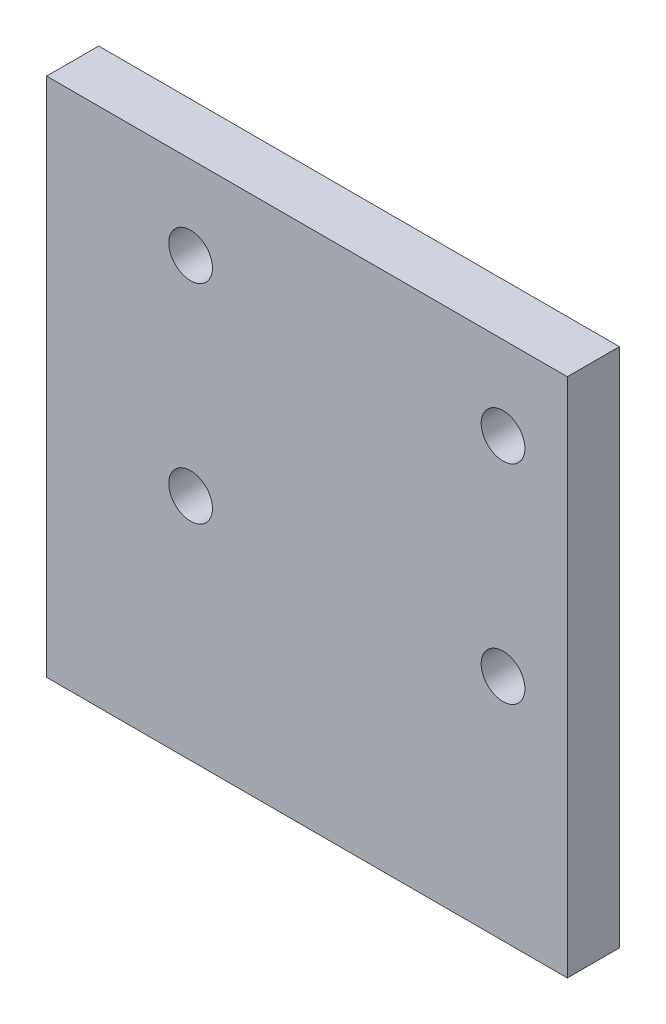
ISO-10303-21;
HEADER;
FILE_DESCRIPTION(('STEP AP214'),'2;1');
FILE_NAME('part.step','',(''),(''),'','','');
FILE_SCHEMA(('AUTOMOTIVE_DESIGN { 1 0 10303 214 1 1 1 1 }'));
ENDSEC;
DATA;
#1=APPLICATION_CONTEXT('core data for automotive mechanical design processes');
#2=APPLICATION_PROTOCOL_DEFINITION('international standard','automotive_design',2000,#1);
#3=PRODUCT_CONTEXT('',#1,'mechanical');
#4=PRODUCT('Part','Part','',(#3));
#5=PRODUCT_RELATED_PRODUCT_CATEGORY('part','',(#4));
#6=PRODUCT_DEFINITION_FORMATION('','',#4);
#7=PRODUCT_DEFINITION_CONTEXT('part definition',#1,'design');
#8=PRODUCT_DEFINITION('design','',#6,#7);
#9=PRODUCT_DEFINITION_SHAPE('','',#8);
#10=(LENGTH_UNIT() NAMED_UNIT(*) SI_UNIT(.MILLI.,.METRE.));
#11=(NAMED_UNIT(*) PLANE_ANGLE_UNIT() SI_UNIT($,.RADIAN.));
#12=(NAMED_UNIT(*) SI_UNIT($,.STERADIAN.) SOLID_ANGLE_UNIT());
#13=UNCERTAINTY_MEASURE_WITH_UNIT(LENGTH_MEASURE(1.E-05),#10,'distance_accuracy_value','');
#14=(GEOMETRIC_REPRESENTATION_CONTEXT(3) GLOBAL_UNCERTAINTY_ASSIGNED_CONTEXT((#13)) GLOBAL_UNIT_ASSIGNED_CONTEXT((#10,
#11,#12)) REPRESENTATION_CONTEXT('',''));
#15=CARTESIAN_POINT('',(0.,0.,0.));
#16=DIRECTION('',(0.,0.,1.));
#17=DIRECTION('',(1.,0.,0.));
#18=AXIS2_PLACEMENT_3D('',#15,#16,#17);
#19=CARTESIAN_POINT('',(25.,25.,5.));
#20=DIRECTION('',(-1.,0.,0.));
#21=DIRECTION('',(0.,-1.,0.));
#22=AXIS2_PLACEMENT_3D('',#19,#20,#21);
#23=PLANE('',#22);
#24=DIRECTION('',(0.,1.,0.));
#25=VECTOR('',#24,1.);
#26=CARTESIAN_POINT('',(25.,25.,0.));
#27=LINE('',#26,#25);
#28=CARTESIAN_POINT('',(25.,-25.,0.));
#29=VERTEX_POINT('',#28);
#30=CARTESIAN_POINT('',(25.,25.,0.));
#31=VERTEX_POINT('',#30);
#32=EDGE_CURVE('E110',#29,#31,#27,.T.);
#33=ORIENTED_EDGE('',*,*,#32,.T.);
#34=DIRECTION('',(0.,0.,-1.));
#35=VECTOR('',#34,1.);
#36=CARTESIAN_POINT('',(25.,25.,5.));
#37=LINE('',#36,#35);
#38=CARTESIAN_POINT('',(25.,25.,5.));
#39=VERTEX_POINT('',#38);
#40=EDGE_CURVE('E11',#39,#31,#37,.T.);
#41=ORIENTED_EDGE('',*,*,#40,.F.);
#42=DIRECTION('',(0.,1.,0.));
#43=VECTOR('',#42,1.);
#44=CARTESIAN_POINT('',(25.,25.,5.));
#45=LINE('',#44,#43);
#46=CARTESIAN_POINT('',(25.,-25.,5.));
#47=VERTEX_POINT('',#46);
#48=EDGE_CURVE('E94',#47,#39,#45,.T.);
#49=ORIENTED_EDGE('',*,*,#48,.F.);
#50=DIRECTION('',(0.,0.,-1.));
#51=VECTOR('',#50,1.);
#52=CARTESIAN_POINT('',(25.,-25.,5.));
#53=LINE('',#52,#51);
#54=EDGE_CURVE('E106',#47,#29,#53,.T.);
#55=ORIENTED_EDGE('',*,*,#54,.T.);
#56=EDGE_LOOP('',(#33,#41,#49,#55));
#57=FACE_BOUND('',#56,.T.);
#58=ADVANCED_FACE('F42',(#57),#23,.F.);
#59=CARTESIAN_POINT('',(-25.,25.,5.));
#60=DIRECTION('',(0.,-1.,0.));
#61=DIRECTION('',(0.,0.,-1.));
#62=AXIS2_PLACEMENT_3D('',#59,#60,#61);
#63=PLANE('',#62);
#64=DIRECTION('',(-1.,0.,0.));
#65=VECTOR('',#64,1.);
#66=CARTESIAN_POINT('',(-25.,25.,0.));
#67=LINE('',#66,#65);
#68=CARTESIAN_POINT('',(-25.,25.,0.));
#69=VERTEX_POINT('',#68);
#70=EDGE_CURVE('E99',#31,#69,#67,.T.);
#71=ORIENTED_EDGE('',*,*,#70,.T.);
#72=DIRECTION('',(0.,0.,-1.));
#73=VECTOR('',#72,1.);
#74=CARTESIAN_POINT('',(-25.,25.,5.));
#75=LINE('',#74,#73);
#76=CARTESIAN_POINT('',(-25.,25.,5.));
#77=VERTEX_POINT('',#76);
#78=EDGE_CURVE('E51',#77,#69,#75,.T.);
#79=ORIENTED_EDGE('',*,*,#78,.F.);
#80=DIRECTION('',(-1.,0.,0.));
#81=VECTOR('',#80,1.);
#82=CARTESIAN_POINT('',(-25.,25.,5.));
#83=LINE('',#82,#81);
#84=EDGE_CURVE('E89',#39,#77,#83,.T.);
#85=ORIENTED_EDGE('',*,*,#84,.F.);
#86=ORIENTED_EDGE('',*,*,#40,.T.);
#87=EDGE_LOOP('',(#71,#79,#85,#86));
#88=FACE_BOUND('',#87,.T.);
#89=ADVANCED_FACE('F98',(#88),#63,.F.);
#90=CARTESIAN_POINT('',(-25.,25.,5.));
#91=DIRECTION('',(1.,0.,0.));
#92=DIRECTION('',(0.,1.,0.));
#93=AXIS2_PLACEMENT_3D('',#90,#91,#92);
#94=PLANE('',#93);
#95=DIRECTION('',(0.,-1.,0.));
#96=VECTOR('',#95,1.);
#97=CARTESIAN_POINT('',(-25.,25.,0.));
#98=LINE('',#97,#96);
#99=CARTESIAN_POINT('',(-25.,-25.,0.));
#100=VERTEX_POINT('',#99);
#101=EDGE_CURVE('E76',#69,#100,#98,.T.);
#102=ORIENTED_EDGE('',*,*,#101,.T.);
#103=DIRECTION('',(0.,0.,-1.));
#104=VECTOR('',#103,1.);
#105=CARTESIAN_POINT('',(-25.,-25.,5.));
#106=LINE('',#105,#104);
#107=CARTESIAN_POINT('',(-25.,-25.,5.));
#108=VERTEX_POINT('',#107);
#109=EDGE_CURVE('E101',#108,#100,#106,.T.);
#110=ORIENTED_EDGE('',*,*,#109,.F.);
#111=DIRECTION('',(0.,-1.,0.));
#112=VECTOR('',#111,1.);
#113=CARTESIAN_POINT('',(-25.,25.,5.));
#114=LINE('',#113,#112);
#115=EDGE_CURVE('E92',#77,#108,#114,.T.);
#116=ORIENTED_EDGE('',*,*,#115,.F.);
#117=ORIENTED_EDGE('',*,*,#78,.T.);
#118=EDGE_LOOP('',(#102,#110,#116,#117));
#119=FACE_BOUND('',#118,.T.);
#120=ADVANCED_FACE('F102',(#119),#94,.F.);
#121=CARTESIAN_POINT('',(-25.,-25.,5.));
#122=DIRECTION('',(0.,1.,0.));
#123=DIRECTION('',(0.,0.,1.));
#124=AXIS2_PLACEMENT_3D('',#121,#122,#123);
#125=PLANE('',#124);
#126=DIRECTION('',(1.,0.,0.));
#127=VECTOR('',#126,1.);
#128=CARTESIAN_POINT('',(-25.,-25.,0.));
#129=LINE('',#128,#127);
#130=EDGE_CURVE('E82',#100,#29,#129,.T.);
#131=ORIENTED_EDGE('',*,*,#130,.T.);
#132=ORIENTED_EDGE('',*,*,#54,.F.);
#133=DIRECTION('',(1.,0.,0.));
#134=VECTOR('',#133,1.);
#135=CARTESIAN_POINT('',(-25.,-25.,5.));
#136=LINE('',#135,#134);
#137=EDGE_CURVE('E59',#108,#47,#136,.T.);
#138=ORIENTED_EDGE('',*,*,#137,.F.);
#139=ORIENTED_EDGE('',*,*,#109,.T.);
#140=EDGE_LOOP('',(#131,#132,#138,#139));
#141=FACE_BOUND('',#140,.T.);
#142=ADVANCED_FACE('F124',(#141),#125,.F.);
#143=CARTESIAN_POINT('',(0.,0.,5.));
#144=DIRECTION('',(0.,0.,1.));
#145=DIRECTION('',(1.,0.,0.));
#146=AXIS2_PLACEMENT_3D('',#143,#144,#145);
#147=PLANE('',#146);
#148=CARTESIAN_POINT('',(18.8264685112438,-3.00000000000002,5.));
#149=DIRECTION('',(0.,0.,1.));
#150=DIRECTION('',(1.,0.,0.));
#151=AXIS2_PLACEMENT_3D('',#148,#149,#150);
#152=CIRCLE('',#151,2.1);
#153=CARTESIAN_POINT('',(20.9264685112438,-3.00000000000002,5.));
#154=VERTEX_POINT('',#153);
#155=EDGE_CURVE('E135',#154,#154,#152,.T.);
#156=ORIENTED_EDGE('',*,*,#155,.F.);
#157=EDGE_LOOP('',(#156));
#158=FACE_BOUND('',#157,.T.);
#159=CARTESIAN_POINT('',(-11.1735314887562,17.,5.));
#160=DIRECTION('',(0.,0.,1.));
#161=DIRECTION('',(1.,0.,0.));
#162=AXIS2_PLACEMENT_3D('',#159,#160,#161);
#163=CIRCLE('',#162,2.1);
#164=CARTESIAN_POINT('',(-9.07353148875616,17.,5.));
#165=VERTEX_POINT('',#164);
#166=EDGE_CURVE('E143',#165,#165,#163,.T.);
#167=ORIENTED_EDGE('',*,*,#166,.F.);
#168=EDGE_LOOP('',(#167));
#169=FACE_BOUND('',#168,.T.);
#170=CARTESIAN_POINT('',(18.8264685112438,17.,5.));
#171=DIRECTION('',(0.,0.,1.));
#172=DIRECTION('',(1.,0.,0.));
#173=AXIS2_PLACEMENT_3D('',#170,#171,#172);
#174=CIRCLE('',#173,2.1);
#175=CARTESIAN_POINT('',(20.9264685112438,17.,5.));
#176=VERTEX_POINT('',#175);
#177=EDGE_CURVE('E144',#176,#176,#174,.T.);
#178=ORIENTED_EDGE('',*,*,#177,.F.);
#179=EDGE_LOOP('',(#178));
#180=FACE_BOUND('',#179,.T.);
#181=CARTESIAN_POINT('',(-11.1735314887562,-3.00000000000002,5.));
#182=DIRECTION('',(0.,0.,1.));
#183=DIRECTION('',(1.,0.,0.));
#184=AXIS2_PLACEMENT_3D('',#181,#182,#183);
#185=CIRCLE('',#184,2.1);
#186=CARTESIAN_POINT('',(-9.07353148875616,-3.00000000000002,5.));
#187=VERTEX_POINT('',#186);
#188=EDGE_CURVE('E131',#187,#187,#185,.T.);
#189=ORIENTED_EDGE('',*,*,#188,.F.);
#190=EDGE_LOOP('',(#189));
#191=FACE_BOUND('',#190,.T.);
#192=ORIENTED_EDGE('',*,*,#48,.T.);
#193=ORIENTED_EDGE('',*,*,#84,.T.);
#194=ORIENTED_EDGE('',*,*,#115,.T.);
#195=ORIENTED_EDGE('',*,*,#137,.T.);
#196=EDGE_LOOP('',(#192,#193,#194,#195));
#197=FACE_BOUND('',#196,.T.);
#198=ADVANCED_FACE('F90',(#158,#169,#180,#191,#197),#147,.T.);
#199=CARTESIAN_POINT('',(0.,0.,0.));
#200=DIRECTION('',(0.,0.,1.));
#201=DIRECTION('',(1.,0.,0.));
#202=AXIS2_PLACEMENT_3D('',#199,#200,#201);
#203=PLANE('',#202);
#204=CARTESIAN_POINT('',(18.8264685112438,-3.00000000000002,0.));
#205=DIRECTION('',(0.,0.,1.));
#206=DIRECTION('',(1.,0.,0.));
#207=AXIS2_PLACEMENT_3D('',#204,#205,#206);
#208=CIRCLE('',#207,2.1);
#209=CARTESIAN_POINT('',(20.9264685112438,-3.00000000000002,0.));
#210=VERTEX_POINT('',#209);
#211=EDGE_CURVE('E148',#210,#210,#208,.T.);
#212=ORIENTED_EDGE('',*,*,#211,.T.);
#213=EDGE_LOOP('',(#212));
#214=FACE_BOUND('',#213,.T.);
#215=CARTESIAN_POINT('',(-11.1735314887562,17.,0.));
#216=DIRECTION('',(0.,0.,1.));
#217=DIRECTION('',(1.,0.,0.));
#218=AXIS2_PLACEMENT_3D('',#215,#216,#217);
#219=CIRCLE('',#218,2.1);
#220=CARTESIAN_POINT('',(-9.07353148875616,17.,0.));
#221=VERTEX_POINT('',#220);
#222=EDGE_CURVE('E139',#221,#221,#219,.T.);
#223=ORIENTED_EDGE('',*,*,#222,.T.);
#224=EDGE_LOOP('',(#223));
#225=FACE_BOUND('',#224,.T.);
#226=CARTESIAN_POINT('',(18.8264685112438,17.,0.));
#227=DIRECTION('',(0.,0.,1.));
#228=DIRECTION('',(1.,0.,0.));
#229=AXIS2_PLACEMENT_3D('',#226,#227,#228);
#230=CIRCLE('',#229,2.1);
#231=CARTESIAN_POINT('',(20.9264685112438,17.,0.));
#232=VERTEX_POINT('',#231);
#233=EDGE_CURVE('E155',#232,#232,#230,.T.);
#234=ORIENTED_EDGE('',*,*,#233,.T.);
#235=EDGE_LOOP('',(#234));
#236=FACE_BOUND('',#235,.T.);
#237=CARTESIAN_POINT('',(-11.1735314887562,-3.00000000000002,0.));
#238=DIRECTION('',(0.,0.,1.));
#239=DIRECTION('',(1.,0.,0.));
#240=AXIS2_PLACEMENT_3D('',#237,#238,#239);
#241=CIRCLE('',#240,2.1);
#242=CARTESIAN_POINT('',(-9.07353148875616,-3.00000000000002,0.));
#243=VERTEX_POINT('',#242);
#244=EDGE_CURVE('E114',#243,#243,#241,.T.);
#245=ORIENTED_EDGE('',*,*,#244,.T.);
#246=EDGE_LOOP('',(#245));
#247=FACE_BOUND('',#246,.T.);
#248=ORIENTED_EDGE('',*,*,#32,.F.);
#249=ORIENTED_EDGE('',*,*,#130,.F.);
#250=ORIENTED_EDGE('',*,*,#101,.F.);
#251=ORIENTED_EDGE('',*,*,#70,.F.);
#252=EDGE_LOOP('',(#248,#249,#250,#251));
#253=FACE_BOUND('',#252,.T.);
#254=ADVANCED_FACE('F127',(#214,#225,#236,#247,#253),#203,.F.);
#255=CARTESIAN_POINT('',(-11.1735314887562,-3.00000000000002,0.));
#256=DIRECTION('',(0.,0.,1.));
#257=DIRECTION('',(1.,0.,0.));
#258=AXIS2_PLACEMENT_3D('',#255,#256,#257);
#259=CYLINDRICAL_SURFACE('',#258,2.1);
#260=ORIENTED_EDGE('',*,*,#244,.F.);
#261=EDGE_LOOP('',(#260));
#262=FACE_BOUND('',#261,.T.);
#263=ORIENTED_EDGE('',*,*,#188,.T.);
#264=EDGE_LOOP('',(#263));
#265=FACE_BOUND('',#264,.T.);
#266=ADVANCED_FACE('F171',(#262,#265),#259,.F.);
#267=CARTESIAN_POINT('',(18.8264685112438,17.,0.));
#268=DIRECTION('',(0.,0.,1.));
#269=DIRECTION('',(1.,0.,0.));
#270=AXIS2_PLACEMENT_3D('',#267,#268,#269);
#271=CYLINDRICAL_SURFACE('',#270,2.1);
#272=ORIENTED_EDGE('',*,*,#233,.F.);
#273=EDGE_LOOP('',(#272));
#274=FACE_BOUND('',#273,.T.);
#275=ORIENTED_EDGE('',*,*,#177,.T.);
#276=EDGE_LOOP('',(#275));
#277=FACE_BOUND('',#276,.T.);
#278=ADVANCED_FACE('F163',(#274,#277),#271,.F.);
#279=CARTESIAN_POINT('',(-11.1735314887562,17.,0.));
#280=DIRECTION('',(0.,0.,1.));
#281=DIRECTION('',(1.,0.,0.));
#282=AXIS2_PLACEMENT_3D('',#279,#280,#281);
#283=CYLINDRICAL_SURFACE('',#282,2.1);
#284=ORIENTED_EDGE('',*,*,#222,.F.);
#285=EDGE_LOOP('',(#284));
#286=FACE_BOUND('',#285,.T.);
#287=ORIENTED_EDGE('',*,*,#166,.T.);
#288=EDGE_LOOP('',(#287));
#289=FACE_BOUND('',#288,.T.);
#290=ADVANCED_FACE('F179',(#286,#289),#283,.F.);
#291=CARTESIAN_POINT('',(18.8264685112438,-3.00000000000002,0.));
#292=DIRECTION('',(0.,0.,1.));
#293=DIRECTION('',(1.,0.,0.));
#294=AXIS2_PLACEMENT_3D('',#291,#292,#293);
#295=CYLINDRICAL_SURFACE('',#294,2.1);
#296=ORIENTED_EDGE('',*,*,#211,.F.);
#297=EDGE_LOOP('',(#296));
#298=FACE_BOUND('',#297,.T.);
#299=ORIENTED_EDGE('',*,*,#155,.T.);
#300=EDGE_LOOP('',(#299));
#301=FACE_BOUND('',#300,.T.);
#302=ADVANCED_FACE('F233',(#298,#301),#295,.F.);
#303=CLOSED_SHELL('',(#58,#89,#120,#142,#198,#254,#266,#278,#290,#302));
#304=MANIFOLD_SOLID_BREP('B2',#303);
#305=ADVANCED_BREP_SHAPE_REPRESENTATION('',(#18,#304),#14);
#306=SHAPE_DEFINITION_REPRESENTATION(#9,#305);
ENDSEC;
END-ISO-10303-21;
